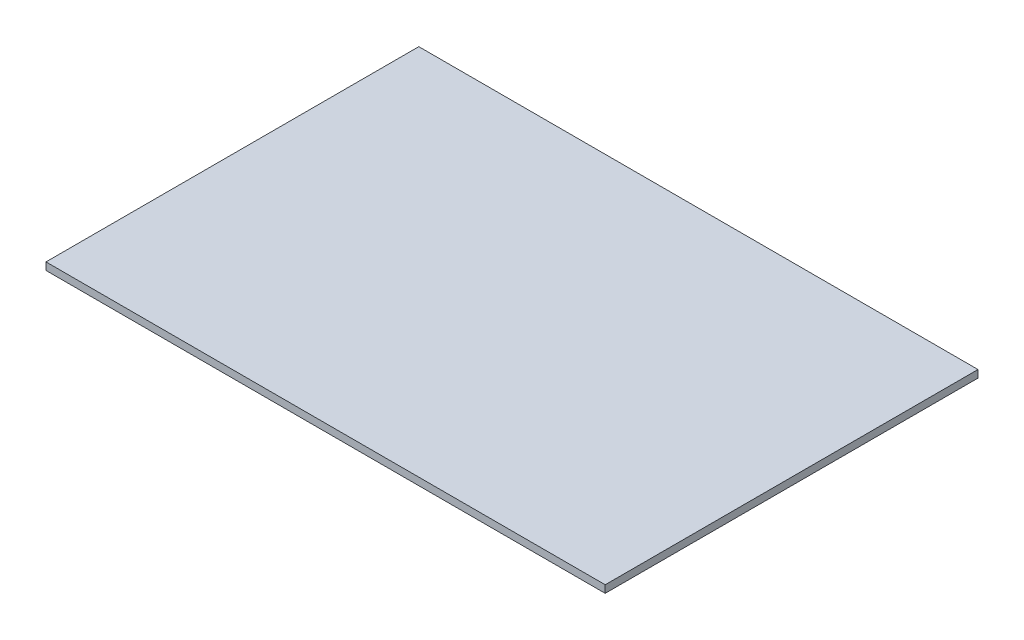
ISO-10303-21;
HEADER;
FILE_DESCRIPTION(('STEP AP214'),'2;1');
FILE_NAME('part.step','',(''),(''),'','','');
FILE_SCHEMA(('AUTOMOTIVE_DESIGN { 1 0 10303 214 1 1 1 1 }'));
ENDSEC;
DATA;
#1=APPLICATION_CONTEXT('core data for automotive mechanical design processes');
#2=APPLICATION_PROTOCOL_DEFINITION('international standard','automotive_design',2000,#1);
#3=PRODUCT_CONTEXT('',#1,'mechanical');
#4=PRODUCT('Part','Part','',(#3));
#5=PRODUCT_RELATED_PRODUCT_CATEGORY('part','',(#4));
#6=PRODUCT_DEFINITION_FORMATION('','',#4);
#7=PRODUCT_DEFINITION_CONTEXT('part definition',#1,'design');
#8=PRODUCT_DEFINITION('design','',#6,#7);
#9=PRODUCT_DEFINITION_SHAPE('','',#8);
#10=(LENGTH_UNIT() NAMED_UNIT(*) SI_UNIT(.MILLI.,.METRE.));
#11=(NAMED_UNIT(*) PLANE_ANGLE_UNIT() SI_UNIT($,.RADIAN.));
#12=(NAMED_UNIT(*) SI_UNIT($,.STERADIAN.) SOLID_ANGLE_UNIT());
#13=UNCERTAINTY_MEASURE_WITH_UNIT(LENGTH_MEASURE(1.E-05),#10,'distance_accuracy_value','');
#14=(GEOMETRIC_REPRESENTATION_CONTEXT(3) GLOBAL_UNCERTAINTY_ASSIGNED_CONTEXT((#13)) GLOBAL_UNIT_ASSIGNED_CONTEXT((#10,
#11,#12)) REPRESENTATION_CONTEXT('',''));
#15=CARTESIAN_POINT('',(0.,0.,0.));
#16=DIRECTION('',(0.,0.,1.));
#17=DIRECTION('',(1.,0.,0.));
#18=AXIS2_PLACEMENT_3D('',#15,#16,#17);
#19=CARTESIAN_POINT('',(0.,1.,0.));
#20=DIRECTION('',(-1.,0.,0.));
#21=DIRECTION('',(0.,0.,1.));
#22=AXIS2_PLACEMENT_3D('',#19,#20,#21);
#23=PLANE('',#22);
#24=DIRECTION('',(0.,0.,-1.));
#25=VECTOR('',#24,1.);
#26=CARTESIAN_POINT('',(0.,0.,0.));
#27=LINE('',#26,#25);
#28=CARTESIAN_POINT('',(0.,0.,0.));
#29=VERTEX_POINT('',#28);
#30=CARTESIAN_POINT('',(0.,0.,-50.));
#31=VERTEX_POINT('',#30);
#32=EDGE_CURVE('E98',#29,#31,#27,.T.);
#33=ORIENTED_EDGE('',*,*,#32,.F.);
#34=DIRECTION('',(0.,-1.,0.));
#35=VECTOR('',#34,1.);
#36=CARTESIAN_POINT('',(0.,1.,0.));
#37=LINE('',#36,#35);
#38=CARTESIAN_POINT('',(0.,1.,0.));
#39=VERTEX_POINT('',#38);
#40=EDGE_CURVE('E11',#39,#29,#37,.T.);
#41=ORIENTED_EDGE('',*,*,#40,.F.);
#42=DIRECTION('',(0.,0.,-1.));
#43=VECTOR('',#42,1.);
#44=CARTESIAN_POINT('',(0.,1.,0.));
#45=LINE('',#44,#43);
#46=CARTESIAN_POINT('',(0.,1.,-50.));
#47=VERTEX_POINT('',#46);
#48=EDGE_CURVE('E93',#39,#47,#45,.T.);
#49=ORIENTED_EDGE('',*,*,#48,.T.);
#50=DIRECTION('',(0.,-1.,0.));
#51=VECTOR('',#50,1.);
#52=CARTESIAN_POINT('',(0.,1.,-50.));
#53=LINE('',#52,#51);
#54=EDGE_CURVE('E36',#47,#31,#53,.T.);
#55=ORIENTED_EDGE('',*,*,#54,.T.);
#56=EDGE_LOOP('',(#33,#41,#49,#55));
#57=FACE_BOUND('',#56,.T.);
#58=ADVANCED_FACE('F33',(#57),#23,.T.);
#59=CARTESIAN_POINT('',(0.,1.,0.));
#60=DIRECTION('',(0.,0.,-1.));
#61=DIRECTION('',(-1.,0.,0.));
#62=AXIS2_PLACEMENT_3D('',#59,#60,#61);
#63=PLANE('',#62);
#64=DIRECTION('',(1.,0.,0.));
#65=VECTOR('',#64,1.);
#66=CARTESIAN_POINT('',(0.,0.,0.));
#67=LINE('',#66,#65);
#68=CARTESIAN_POINT('',(75.,0.,0.));
#69=VERTEX_POINT('',#68);
#70=EDGE_CURVE('E66',#29,#69,#67,.T.);
#71=ORIENTED_EDGE('',*,*,#70,.T.);
#72=DIRECTION('',(0.,-1.,0.));
#73=VECTOR('',#72,1.);
#74=CARTESIAN_POINT('',(75.,1.,0.));
#75=LINE('',#74,#73);
#76=CARTESIAN_POINT('',(75.,1.,0.));
#77=VERTEX_POINT('',#76);
#78=EDGE_CURVE('E42',#77,#69,#75,.T.);
#79=ORIENTED_EDGE('',*,*,#78,.F.);
#80=DIRECTION('',(1.,0.,0.));
#81=VECTOR('',#80,1.);
#82=CARTESIAN_POINT('',(0.,1.,0.));
#83=LINE('',#82,#81);
#84=EDGE_CURVE('E83',#39,#77,#83,.T.);
#85=ORIENTED_EDGE('',*,*,#84,.F.);
#86=ORIENTED_EDGE('',*,*,#40,.T.);
#87=EDGE_LOOP('',(#71,#79,#85,#86));
#88=FACE_BOUND('',#87,.T.);
#89=ADVANCED_FACE('F108',(#88),#63,.F.);
#90=CARTESIAN_POINT('',(75.,1.,0.));
#91=DIRECTION('',(-1.,0.,0.));
#92=DIRECTION('',(0.,0.,1.));
#93=AXIS2_PLACEMENT_3D('',#90,#91,#92);
#94=PLANE('',#93);
#95=DIRECTION('',(0.,0.,-1.));
#96=VECTOR('',#95,1.);
#97=CARTESIAN_POINT('',(75.,0.,0.));
#98=LINE('',#97,#96);
#99=CARTESIAN_POINT('',(75.,0.,-50.));
#100=VERTEX_POINT('',#99);
#101=EDGE_CURVE('E90',#69,#100,#98,.T.);
#102=ORIENTED_EDGE('',*,*,#101,.T.);
#103=DIRECTION('',(0.,-1.,0.));
#104=VECTOR('',#103,1.);
#105=CARTESIAN_POINT('',(75.,1.,-50.));
#106=LINE('',#105,#104);
#107=CARTESIAN_POINT('',(75.,1.,-50.));
#108=VERTEX_POINT('',#107);
#109=EDGE_CURVE('E87',#108,#100,#106,.T.);
#110=ORIENTED_EDGE('',*,*,#109,.F.);
#111=DIRECTION('',(0.,0.,-1.));
#112=VECTOR('',#111,1.);
#113=CARTESIAN_POINT('',(75.,1.,0.));
#114=LINE('',#113,#112);
#115=EDGE_CURVE('E78',#77,#108,#114,.T.);
#116=ORIENTED_EDGE('',*,*,#115,.F.);
#117=ORIENTED_EDGE('',*,*,#78,.T.);
#118=EDGE_LOOP('',(#102,#110,#116,#117));
#119=FACE_BOUND('',#118,.T.);
#120=ADVANCED_FACE('F88',(#119),#94,.F.);
#121=CARTESIAN_POINT('',(0.,1.,-50.));
#122=DIRECTION('',(0.,0.,-1.));
#123=DIRECTION('',(-1.,0.,0.));
#124=AXIS2_PLACEMENT_3D('',#121,#122,#123);
#125=PLANE('',#124);
#126=DIRECTION('',(1.,0.,0.));
#127=VECTOR('',#126,1.);
#128=CARTESIAN_POINT('',(0.,0.,-50.));
#129=LINE('',#128,#127);
#130=EDGE_CURVE('E101',#31,#100,#129,.T.);
#131=ORIENTED_EDGE('',*,*,#130,.F.);
#132=ORIENTED_EDGE('',*,*,#54,.F.);
#133=DIRECTION('',(1.,0.,0.));
#134=VECTOR('',#133,1.);
#135=CARTESIAN_POINT('',(0.,1.,-50.));
#136=LINE('',#135,#134);
#137=EDGE_CURVE('E82',#47,#108,#136,.T.);
#138=ORIENTED_EDGE('',*,*,#137,.T.);
#139=ORIENTED_EDGE('',*,*,#109,.T.);
#140=EDGE_LOOP('',(#131,#132,#138,#139));
#141=FACE_BOUND('',#140,.T.);
#142=ADVANCED_FACE('F92',(#141),#125,.T.);
#143=CARTESIAN_POINT('',(0.,1.,0.));
#144=DIRECTION('',(0.,-1.,0.));
#145=DIRECTION('',(0.,0.,-1.));
#146=AXIS2_PLACEMENT_3D('',#143,#144,#145);
#147=PLANE('',#146);
#148=ORIENTED_EDGE('',*,*,#48,.F.);
#149=ORIENTED_EDGE('',*,*,#84,.T.);
#150=ORIENTED_EDGE('',*,*,#115,.T.);
#151=ORIENTED_EDGE('',*,*,#137,.F.);
#152=EDGE_LOOP('',(#148,#149,#150,#151));
#153=FACE_BOUND('',#152,.T.);
#154=ADVANCED_FACE('F81',(#153),#147,.F.);
#155=CARTESIAN_POINT('',(0.,0.,0.));
#156=DIRECTION('',(0.,-1.,0.));
#157=DIRECTION('',(0.,0.,-1.));
#158=AXIS2_PLACEMENT_3D('',#155,#156,#157);
#159=PLANE('',#158);
#160=ORIENTED_EDGE('',*,*,#32,.T.);
#161=ORIENTED_EDGE('',*,*,#130,.T.);
#162=ORIENTED_EDGE('',*,*,#101,.F.);
#163=ORIENTED_EDGE('',*,*,#70,.F.);
#164=EDGE_LOOP('',(#160,#161,#162,#163));
#165=FACE_BOUND('',#164,.T.);
#166=ADVANCED_FACE('F106',(#165),#159,.T.);
#167=CLOSED_SHELL('',(#58,#89,#120,#142,#154,#166));
#168=MANIFOLD_SOLID_BREP('B2',#167);
#169=ADVANCED_BREP_SHAPE_REPRESENTATION('',(#18,#168),#14);
#170=SHAPE_DEFINITION_REPRESENTATION(#9,#169);
ENDSEC;
END-ISO-10303-21;
